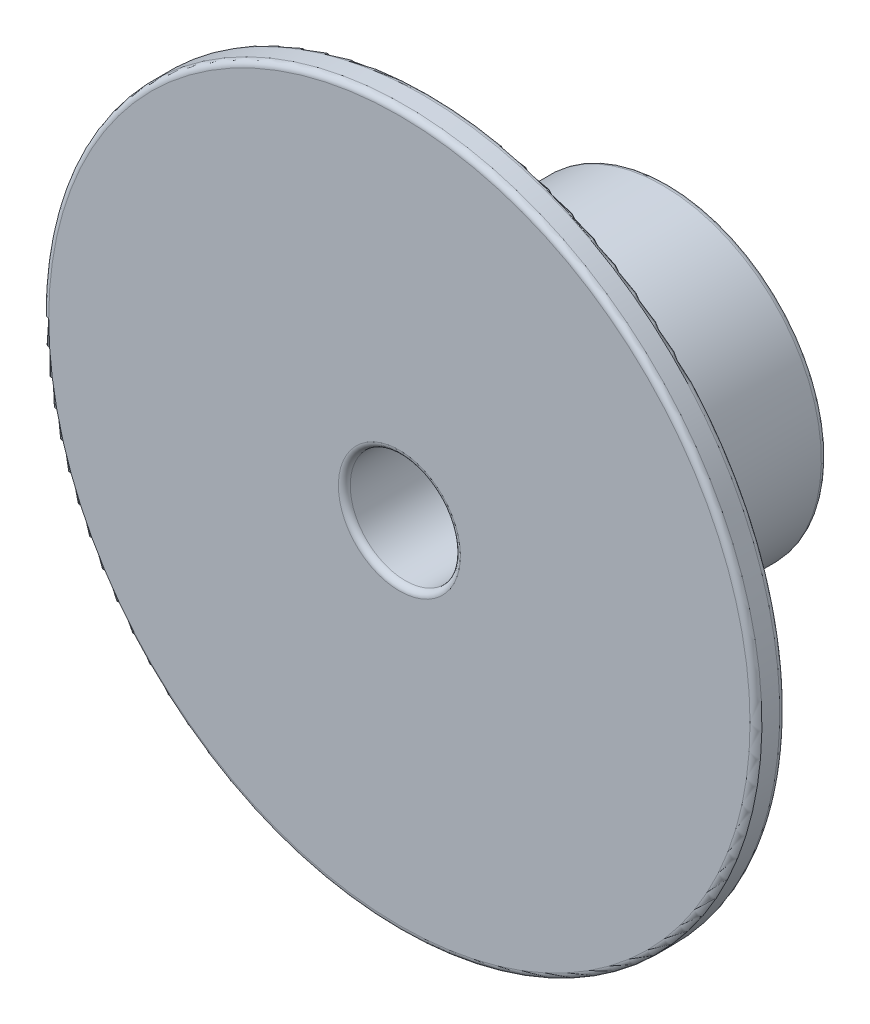
ISO-10303-21;
HEADER;
FILE_DESCRIPTION(('STEP AP214'),'2;1');
FILE_NAME('part.step','',(''),(''),'','','');
FILE_SCHEMA(('AUTOMOTIVE_DESIGN { 1 0 10303 214 1 1 1 1 }'));
ENDSEC;
DATA;
#1=APPLICATION_CONTEXT('core data for automotive mechanical design processes');
#2=APPLICATION_PROTOCOL_DEFINITION('international standard','automotive_design',2000,#1);
#3=PRODUCT_CONTEXT('',#1,'mechanical');
#4=PRODUCT('Part','Part','',(#3));
#5=PRODUCT_RELATED_PRODUCT_CATEGORY('part','',(#4));
#6=PRODUCT_DEFINITION_FORMATION('','',#4);
#7=PRODUCT_DEFINITION_CONTEXT('part definition',#1,'design');
#8=PRODUCT_DEFINITION('design','',#6,#7);
#9=PRODUCT_DEFINITION_SHAPE('','',#8);
#10=(LENGTH_UNIT() NAMED_UNIT(*) SI_UNIT(.MILLI.,.METRE.));
#11=(NAMED_UNIT(*) PLANE_ANGLE_UNIT() SI_UNIT($,.RADIAN.));
#12=(NAMED_UNIT(*) SI_UNIT($,.STERADIAN.) SOLID_ANGLE_UNIT());
#13=UNCERTAINTY_MEASURE_WITH_UNIT(LENGTH_MEASURE(1.E-05),#10,'distance_accuracy_value','');
#14=(GEOMETRIC_REPRESENTATION_CONTEXT(3) GLOBAL_UNCERTAINTY_ASSIGNED_CONTEXT((#13)) GLOBAL_UNIT_ASSIGNED_CONTEXT((#10,
#11,#12)) REPRESENTATION_CONTEXT('',''));
#15=CARTESIAN_POINT('',(0.,0.,0.));
#16=DIRECTION('',(0.,0.,1.));
#17=DIRECTION('',(1.,0.,0.));
#18=AXIS2_PLACEMENT_3D('',#15,#16,#17);
#19=CARTESIAN_POINT('',(0.,0.,12.21));
#20=DIRECTION('',(0.,0.,1.));
#21=DIRECTION('',(0.,-1.,0.));
#22=AXIS2_PLACEMENT_3D('',#19,#20,#21);
#23=CYLINDRICAL_SURFACE('',#22,18.);
#24=CARTESIAN_POINT('',(0.,0.,12.2999999999999));
#25=DIRECTION('',(0.,0.,-1.));
#26=DIRECTION('',(0.,1.,0.));
#27=AXIS2_PLACEMENT_3D('',#24,#25,#26);
#28=CIRCLE('',#27,18.);
#29=CARTESIAN_POINT('',(0.,18.,12.2999999999999));
#30=VERTEX_POINT('',#29);
#31=EDGE_CURVE('E116',#30,#30,#28,.T.);
#32=ORIENTED_EDGE('',*,*,#31,.F.);
#33=EDGE_LOOP('',(#32));
#34=FACE_BOUND('',#33,.T.);
#35=CARTESIAN_POINT('',(0.,0.,13.2000000000001));
#36=DIRECTION('',(0.,0.,1.));
#37=DIRECTION('',(0.,-1.,0.));
#38=AXIS2_PLACEMENT_3D('',#35,#36,#37);
#39=CIRCLE('',#38,18.);
#40=CARTESIAN_POINT('',(0.,-18.,13.2000000000001));
#41=VERTEX_POINT('',#40);
#42=EDGE_CURVE('E114',#41,#41,#39,.T.);
#43=ORIENTED_EDGE('',*,*,#42,.F.);
#44=EDGE_LOOP('',(#43));
#45=FACE_BOUND('',#44,.T.);
#46=ADVANCED_FACE('F17',(#34,#45),#23,.T.);
#47=CARTESIAN_POINT('',(0.,0.,12.3));
#48=DIRECTION('',(0.,0.,-1.));
#49=DIRECTION('',(0.,1.,0.));
#50=AXIS2_PLACEMENT_3D('',#47,#48,#49);
#51=TOROIDAL_SURFACE('',#50,17.7,0.300000000000005);
#52=ORIENTED_EDGE('',*,*,#31,.T.);
#53=EDGE_LOOP('',(#52));
#54=FACE_BOUND('',#53,.T.);
#55=CARTESIAN_POINT('',(0.,0.,12.));
#56=DIRECTION('',(0.,0.,-1.));
#57=DIRECTION('',(0.,1.,0.));
#58=AXIS2_PLACEMENT_3D('',#55,#56,#57);
#59=CIRCLE('',#58,17.7);
#60=CARTESIAN_POINT('',(0.,17.7,12.));
#61=VERTEX_POINT('',#60);
#62=EDGE_CURVE('E21',#61,#61,#59,.T.);
#63=ORIENTED_EDGE('',*,*,#62,.F.);
#64=EDGE_LOOP('',(#63));
#65=FACE_BOUND('',#64,.T.);
#66=ADVANCED_FACE('F120',(#54,#65),#51,.T.);
#67=CARTESIAN_POINT('',(0.,0.,13.2));
#68=DIRECTION('',(0.,0.,1.));
#69=DIRECTION('',(0.,-1.,0.));
#70=AXIS2_PLACEMENT_3D('',#67,#68,#69);
#71=TOROIDAL_SURFACE('',#70,17.7,0.299999999999994);
#72=ORIENTED_EDGE('',*,*,#42,.T.);
#73=EDGE_LOOP('',(#72));
#74=FACE_BOUND('',#73,.T.);
#75=CARTESIAN_POINT('',(0.,0.,13.5));
#76=DIRECTION('',(0.,0.,1.));
#77=DIRECTION('',(0.,-1.,0.));
#78=AXIS2_PLACEMENT_3D('',#75,#76,#77);
#79=CIRCLE('',#78,17.7);
#80=CARTESIAN_POINT('',(0.,-17.7,13.5));
#81=VERTEX_POINT('',#80);
#82=EDGE_CURVE('E135',#81,#81,#79,.T.);
#83=ORIENTED_EDGE('',*,*,#82,.F.);
#84=EDGE_LOOP('',(#83));
#85=FACE_BOUND('',#84,.T.);
#86=ADVANCED_FACE('F128',(#74,#85),#71,.T.);
#87=CARTESIAN_POINT('',(17.9124,-17.9124,12.));
#88=DIRECTION('',(0.,0.,-1.));
#89=DIRECTION('',(-1.,0.,0.));
#90=AXIS2_PLACEMENT_3D('',#87,#88,#89);
#91=PLANE('',#90);
#92=CARTESIAN_POINT('',(0.,0.,12.));
#93=DIRECTION('',(0.,0.,-1.));
#94=DIRECTION('',(-1.,0.,0.));
#95=AXIS2_PLACEMENT_3D('',#92,#93,#94);
#96=CIRCLE('',#95,8.49999999999987);
#97=CARTESIAN_POINT('',(-8.49999999999987,0.,12.));
#98=VERTEX_POINT('',#97);
#99=EDGE_CURVE('E137',#98,#98,#96,.T.);
#100=ORIENTED_EDGE('',*,*,#99,.F.);
#101=EDGE_LOOP('',(#100));
#102=FACE_BOUND('',#101,.T.);
#103=ORIENTED_EDGE('',*,*,#62,.T.);
#104=EDGE_LOOP('',(#103));
#105=FACE_BOUND('',#104,.T.);
#106=ADVANCED_FACE('F131',(#102,#105),#91,.T.);
#107=CARTESIAN_POINT('',(-17.9124,-17.9124,13.5));
#108=DIRECTION('',(0.,0.,1.));
#109=DIRECTION('',(1.,0.,0.));
#110=AXIS2_PLACEMENT_3D('',#107,#108,#109);
#111=PLANE('',#110);
#112=CARTESIAN_POINT('',(0.,0.,13.5));
#113=DIRECTION('',(0.,0.,1.));
#114=DIRECTION('',(0.,-1.,0.));
#115=AXIS2_PLACEMENT_3D('',#112,#113,#114);
#116=CIRCLE('',#115,3.07999999999992);
#117=CARTESIAN_POINT('',(0.,-3.07999999999992,13.5));
#118=VERTEX_POINT('',#117);
#119=EDGE_CURVE('E111',#118,#118,#116,.T.);
#120=ORIENTED_EDGE('',*,*,#119,.F.);
#121=EDGE_LOOP('',(#120));
#122=FACE_BOUND('',#121,.T.);
#123=ORIENTED_EDGE('',*,*,#82,.T.);
#124=EDGE_LOOP('',(#123));
#125=FACE_BOUND('',#124,.T.);
#126=ADVANCED_FACE('F147',(#122,#125),#111,.T.);
#127=CARTESIAN_POINT('',(0.,0.,11.5));
#128=DIRECTION('',(0.,0.,-1.));
#129=DIRECTION('',(-1.,0.,0.));
#130=AXIS2_PLACEMENT_3D('',#127,#128,#129);
#131=TOROIDAL_SURFACE('',#130,8.49999999999999,0.499999999999988);
#132=ORIENTED_EDGE('',*,*,#99,.T.);
#133=EDGE_LOOP('',(#132));
#134=FACE_BOUND('',#133,.T.);
#135=CARTESIAN_POINT('',(0.,0.,11.5));
#136=DIRECTION('',(0.,0.,-1.));
#137=DIRECTION('',(-1.,0.,0.));
#138=AXIS2_PLACEMENT_3D('',#135,#136,#137);
#139=CIRCLE('',#138,8.);
#140=CARTESIAN_POINT('',(-8.,0.,11.5));
#141=VERTEX_POINT('',#140);
#142=EDGE_CURVE('E108',#141,#141,#139,.T.);
#143=ORIENTED_EDGE('',*,*,#142,.F.);
#144=EDGE_LOOP('',(#143));
#145=FACE_BOUND('',#144,.T.);
#146=ADVANCED_FACE('F149',(#134,#145),#131,.F.);
#147=CARTESIAN_POINT('',(0.,0.,13.2));
#148=DIRECTION('',(0.,0.,1.));
#149=DIRECTION('',(0.,-1.,0.));
#150=AXIS2_PLACEMENT_3D('',#147,#148,#149);
#151=TOROIDAL_SURFACE('',#150,3.08,0.300000000000005);
#152=CARTESIAN_POINT('',(0.,0.,13.2));
#153=DIRECTION('',(0.,0.,1.));
#154=DIRECTION('',(0.,-1.,0.));
#155=AXIS2_PLACEMENT_3D('',#152,#153,#154);
#156=CIRCLE('',#155,2.78);
#157=CARTESIAN_POINT('',(0.,-2.78,13.2));
#158=VERTEX_POINT('',#157);
#159=EDGE_CURVE('E104',#158,#158,#156,.T.);
#160=ORIENTED_EDGE('',*,*,#159,.F.);
#161=EDGE_LOOP('',(#160));
#162=FACE_BOUND('',#161,.T.);
#163=ORIENTED_EDGE('',*,*,#119,.T.);
#164=EDGE_LOOP('',(#163));
#165=FACE_BOUND('',#164,.T.);
#166=ADVANCED_FACE('F145',(#162,#165),#151,.T.);
#167=CARTESIAN_POINT('',(0.,0.,0.20044822754096));
#168=DIRECTION('',(0.,0.,1.));
#169=DIRECTION('',(1.,0.,0.));
#170=AXIS2_PLACEMENT_3D('',#167,#168,#169);
#171=CYLINDRICAL_SURFACE('',#170,8.);
#172=CARTESIAN_POINT('',(0.,0.,0.20044822754096));
#173=DIRECTION('',(0.,0.,-1.));
#174=DIRECTION('',(0.,1.,0.));
#175=AXIS2_PLACEMENT_3D('',#172,#173,#174);
#176=CIRCLE('',#175,8.);
#177=CARTESIAN_POINT('',(0.,8.,0.20044822754096));
#178=VERTEX_POINT('',#177);
#179=EDGE_CURVE('E100',#178,#178,#176,.T.);
#180=ORIENTED_EDGE('',*,*,#179,.F.);
#181=EDGE_LOOP('',(#180));
#182=FACE_BOUND('',#181,.T.);
#183=ORIENTED_EDGE('',*,*,#142,.T.);
#184=EDGE_LOOP('',(#183));
#185=FACE_BOUND('',#184,.T.);
#186=ADVANCED_FACE('F162',(#182,#185),#171,.T.);
#187=CARTESIAN_POINT('',(0.,0.,5.61));
#188=DIRECTION('',(0.,0.,1.));
#189=DIRECTION('',(1.,0.,0.));
#190=AXIS2_PLACEMENT_3D('',#187,#188,#189);
#191=CYLINDRICAL_SURFACE('',#190,2.78);
#192=CARTESIAN_POINT('',(0.,0.,6.29999999999995));
#193=DIRECTION('',(0.,0.,1.));
#194=DIRECTION('',(1.,0.,0.));
#195=AXIS2_PLACEMENT_3D('',#192,#193,#194);
#196=CIRCLE('',#195,2.78);
#197=CARTESIAN_POINT('',(2.78,0.,6.29999999999995));
#198=VERTEX_POINT('',#197);
#199=EDGE_CURVE('E97',#198,#198,#196,.T.);
#200=ORIENTED_EDGE('',*,*,#199,.F.);
#201=EDGE_LOOP('',(#200));
#202=FACE_BOUND('',#201,.T.);
#203=ORIENTED_EDGE('',*,*,#159,.T.);
#204=EDGE_LOOP('',(#203));
#205=FACE_BOUND('',#204,.T.);
#206=ADVANCED_FACE('F166',(#202,#205),#191,.F.);
#207=CARTESIAN_POINT('',(0.,0.,0.200448227540976));
#208=DIRECTION('',(0.,0.,-1.));
#209=DIRECTION('',(-1.,0.,0.));
#210=AXIS2_PLACEMENT_3D('',#207,#208,#209);
#211=TOROIDAL_SURFACE('',#210,7.69999999999999,0.300000000000012);
#212=ORIENTED_EDGE('',*,*,#179,.T.);
#213=EDGE_LOOP('',(#212));
#214=FACE_BOUND('',#213,.T.);
#215=CARTESIAN_POINT('',(0.,0.,0.));
#216=DIRECTION('',(0.,0.,-1.));
#217=DIRECTION('',(0.,1.,0.));
#218=AXIS2_PLACEMENT_3D('',#215,#216,#217);
#219=CIRCLE('',#218,7.92320508075689);
#220=CARTESIAN_POINT('',(0.,7.92320508075689,0.));
#221=VERTEX_POINT('',#220);
#222=EDGE_CURVE('E95',#221,#221,#219,.T.);
#223=ORIENTED_EDGE('',*,*,#222,.F.);
#224=EDGE_LOOP('',(#223));
#225=FACE_BOUND('',#224,.T.);
#226=ADVANCED_FACE('F91',(#214,#225),#211,.T.);
#227=CARTESIAN_POINT('',(0.,0.,6.30000000000001));
#228=DIRECTION('',(0.,0.,-1.));
#229=DIRECTION('',(-1.,0.,0.));
#230=AXIS2_PLACEMENT_3D('',#227,#228,#229);
#231=TOROIDAL_SURFACE('',#230,3.08000000000001,0.300000000000012);
#232=ORIENTED_EDGE('',*,*,#199,.T.);
#233=EDGE_LOOP('',(#232));
#234=FACE_BOUND('',#233,.T.);
#235=CARTESIAN_POINT('',(3.08000000000001,0.,6.));
#236=CARTESIAN_POINT('',(3.08116361519987,0.606781346199183,6.));
#237=CARTESIAN_POINT('',(2.84554896013476,1.17866497168449,6.));
#238=CARTESIAN_POINT('',(2.61439116870311,1.73973090277684,6.));
#239=CARTESIAN_POINT('',(2.1778888860546,2.17788888605459,6.));
#240=CARTESIAN_POINT('',(1.74961629746775,2.60778595914609,6.));
#241=CARTESIAN_POINT('',(1.1786649716845,2.84554896013475,6.));
#242=CARTESIAN_POINT('',(0.618478205257921,3.07882924285762,6.));
#243=CARTESIAN_POINT('',(0.,3.08,6.));
#244=CARTESIAN_POINT('',(-0.606817587139169,3.08114868400895,6.));
#245=CARTESIAN_POINT('',(-1.1786649716845,2.84554896013475,6.));
#246=CARTESIAN_POINT('',(-1.73973090270367,2.61439116874529,6.));
#247=CARTESIAN_POINT('',(-2.1778888860546,2.17788888605459,6.));
#248=CARTESIAN_POINT('',(-2.60617681897323,1.75121935709127,6.));
#249=CARTESIAN_POINT('',(-2.84554896013476,1.17866497168449,6.));
#250=CARTESIAN_POINT('',(-2.96280367667811,0.898203336338133,6.));
#251=CARTESIAN_POINT('',(-3.02138723897213,0.600991288474661,6.));
#252=CARTESIAN_POINT('',(-3.08000000000001,0.303631106644211,6.));
#253=CARTESIAN_POINT('',(-3.08000000000001,0.,6.));
#254=B_SPLINE_CURVE_WITH_KNOTS('',2,(#235,#236,#237,#238,#239,#240,#241,#242,#243,#244,#245,
#246,#247,#248,#249,#250,#251,#252,#253),.UNSPECIFIED.,.F.,.F.,(3,2,2,2,2,2,2,2,2,3),(0.,0.125,
0.25,0.375,0.5,0.625,0.75,0.875,0.9375,1.),.UNSPECIFIED.);
#255=CARTESIAN_POINT('',(3.08000000000001,0.,6.));
#256=VERTEX_POINT('',#255);
#257=CARTESIAN_POINT('',(-3.08000000000001,0.,6.));
#258=VERTEX_POINT('',#257);
#259=EDGE_CURVE('E47',#256,#258,#254,.T.);
#260=ORIENTED_EDGE('',*,*,#259,.F.);
#261=CARTESIAN_POINT('',(-3.08000000000001,0.,6.));
#262=CARTESIAN_POINT('',(-3.0811636152052,-0.606781346193596,6.));
#263=CARTESIAN_POINT('',(-2.84554896013476,-1.1786649716845,6.));
#264=CARTESIAN_POINT('',(-2.61439116870774,-1.73973090275841,6.));
#265=CARTESIAN_POINT('',(-2.1778888860546,-2.1778888860546,6.));
#266=CARTESIAN_POINT('',(-1.74961629749977,-2.6077859591275,6.));
#267=CARTESIAN_POINT('',(-1.1786649716845,-2.84554896013476,6.));
#268=CARTESIAN_POINT('',(-0.618478205271911,-3.07882924285697,6.));
#269=CARTESIAN_POINT('',(0.,-3.08000000000001,6.));
#270=CARTESIAN_POINT('',(0.606817587166378,-3.08114868400963,6.));
#271=CARTESIAN_POINT('',(1.1786649716845,-2.84554896013476,6.));
#272=CARTESIAN_POINT('',(1.73973090276281,-2.61439116870928,6.));
#273=CARTESIAN_POINT('',(2.1778888860546,-2.1778888860546,6.));
#274=CARTESIAN_POINT('',(2.60617681896852,-1.75121935707358,6.));
#275=CARTESIAN_POINT('',(2.84554896013476,-1.1786649716845,6.));
#276=CARTESIAN_POINT('',(2.9628036766728,-0.898203336365008,6.));
#277=CARTESIAN_POINT('',(3.02138723897214,-0.600991288474617,6.));
#278=CARTESIAN_POINT('',(3.08000000000001,-0.303631106644184,6.));
#279=CARTESIAN_POINT('',(3.08000000000001,0.,6.));
#280=B_SPLINE_CURVE_WITH_KNOTS('',2,(#261,#262,#263,#264,#265,#266,#267,#268,#269,#270,#271,
#272,#273,#274,#275,#276,#277,#278,#279),.UNSPECIFIED.,.F.,.F.,(3,2,2,2,2,2,2,2,2,3),(0.,0.125,
0.25,0.375,0.5,0.625,0.75,0.875,0.9375,1.),.UNSPECIFIED.);
#281=EDGE_CURVE('E44',#258,#256,#280,.T.);
#282=ORIENTED_EDGE('',*,*,#281,.F.);
#283=EDGE_LOOP('',(#260,#282));
#284=FACE_BOUND('',#283,.T.);
#285=ADVANCED_FACE('F46',(#234,#284),#231,.T.);
#286=CARTESIAN_POINT('',(0.,0.,0.299999999999989));
#287=DIRECTION('',(0.,0.,-1.));
#288=DIRECTION('',(-1.,0.,0.));
#289=AXIS2_PLACEMENT_3D('',#286,#287,#288);
#290=TOROIDAL_SURFACE('',#289,7.92320508075689,0.299999999999985);
#291=ORIENTED_EDGE('',*,*,#222,.T.);
#292=EDGE_LOOP('',(#291));
#293=FACE_BOUND('',#292,.T.);
#294=CARTESIAN_POINT('',(0.,0.,0.149999999999995));
#295=DIRECTION('',(0.,0.,-1.));
#296=DIRECTION('',(0.,1.,0.));
#297=AXIS2_PLACEMENT_3D('',#294,#295,#296);
#298=CIRCLE('',#297,7.66339745962156);
#299=CARTESIAN_POINT('',(0.,7.66339745962156,0.149999999999995));
#300=VERTEX_POINT('',#299);
#301=EDGE_CURVE('E51',#300,#300,#298,.T.);
#302=ORIENTED_EDGE('',*,*,#301,.F.);
#303=EDGE_LOOP('',(#302));
#304=FACE_BOUND('',#303,.T.);
#305=ADVANCED_FACE('F71',(#293,#304),#290,.T.);
#306=CARTESIAN_POINT('',(4.04518992927065,-4.04518992927065,6.));
#307=DIRECTION('',(0.,0.,-1.));
#308=DIRECTION('',(-1.,0.,0.));
#309=AXIS2_PLACEMENT_3D('',#306,#307,#308);
#310=PLANE('',#309);
#311=ORIENTED_EDGE('',*,*,#281,.T.);
#312=ORIENTED_EDGE('',*,*,#259,.T.);
#313=EDGE_LOOP('',(#311,#312));
#314=FACE_BOUND('',#313,.T.);
#315=CARTESIAN_POINT('',(-3.99722325026744,0.,6.));
#316=CARTESIAN_POINT('',(-3.99873327143629,0.787478307971239,6.));
#317=CARTESIAN_POINT('',(-3.69295274780032,1.52967111334185,6.));
#318=CARTESIAN_POINT('',(-3.39295906722217,2.25781804936717,6.));
#319=CARTESIAN_POINT('',(-2.82646366618063,2.82646366618062,6.));
#320=CARTESIAN_POINT('',(-2.27065587609634,3.38438110565338,6.));
#321=CARTESIAN_POINT('',(-1.52967111334186,3.69295274780031,6.));
#322=CARTESIAN_POINT('',(-0.802665911319301,3.99570281813042,6.));
#323=CARTESIAN_POINT('',(0.,3.99722325026743,6.));
#324=CARTESIAN_POINT('',(0.78752266229418,3.99871499764015,6.));
#325=CARTESIAN_POINT('',(1.52967111334186,3.69295274780031,6.));
#326=CARTESIAN_POINT('',(2.25781804942689,3.39295906718688,6.));
#327=CARTESIAN_POINT('',(2.82646366618062,2.82646366618062,6.));
#328=CARTESIAN_POINT('',(3.04919359380279,2.60457594569713,6.));
#329=CARTESIAN_POINT('',(3.2344015480182,2.34993939704879,6.));
#330=CARTESIAN_POINT('',(3.5061841649616,1.9762740874013,6.));
#331=CARTESIAN_POINT('',(3.69295274780032,1.52967111334185,6.));
#332=CARTESIAN_POINT('',(3.84511851335003,1.16581075518293,6.));
#333=CARTESIAN_POINT('',(3.92115562381531,0.779966347997176,6.));
#334=CARTESIAN_POINT('',(3.99722325026744,0.393967089807948,6.));
#335=CARTESIAN_POINT('',(3.99722325026744,0.,6.));
#336=B_SPLINE_CURVE_WITH_KNOTS('',2,(#315,#316,#317,#318,#319,#320,#321,#322,#323,#324,#325,
#326,#327,#328,#329,#330,#331,#332,#333,#334,#335),.UNSPECIFIED.,.F.,.F.,(3,2,2,2,2,2,2,2,2,2,
3),(0.,0.125,0.25,0.375,0.5,0.625,0.75,0.8,0.875,0.9375,1.),.UNSPECIFIED.);
#337=CARTESIAN_POINT('',(-3.99722325026744,0.,6.));
#338=VERTEX_POINT('',#337);
#339=CARTESIAN_POINT('',(3.99722325026744,0.,6.));
#340=VERTEX_POINT('',#339);
#341=EDGE_CURVE('E33',#338,#340,#336,.T.);
#342=ORIENTED_EDGE('',*,*,#341,.T.);
#343=CARTESIAN_POINT('',(0.,0.,6.));
#344=DIRECTION('',(0.,0.,-1.));
#345=DIRECTION('',(0.,1.,0.));
#346=AXIS2_PLACEMENT_3D('',#343,#344,#345);
#347=CIRCLE('',#346,3.99722325026745);
#348=EDGE_CURVE('E26',#338,#340,#347,.F.);
#349=ORIENTED_EDGE('',*,*,#348,.F.);
#350=EDGE_LOOP('',(#342,#349));
#351=FACE_BOUND('',#350,.T.);
#352=ADVANCED_FACE('F50',(#314,#351),#310,.T.);
#353=CARTESIAN_POINT('',(0.,0.,5.75));
#354=DIRECTION('',(0.,0.,-1.));
#355=DIRECTION('',(-1.,0.,0.));
#356=AXIS2_PLACEMENT_3D('',#353,#354,#355);
#357=CONICAL_SURFACE('',#356,4.43023595215965,0.523598775598299);
#358=ORIENTED_EDGE('',*,*,#301,.T.);
#359=EDGE_LOOP('',(#358));
#360=FACE_BOUND('',#359,.T.);
#361=CARTESIAN_POINT('',(0.,0.,5.75));
#362=DIRECTION('',(0.,0.,-1.));
#363=DIRECTION('',(0.,1.,0.));
#364=AXIS2_PLACEMENT_3D('',#361,#362,#363);
#365=CIRCLE('',#364,4.43023595215965);
#366=CARTESIAN_POINT('',(0.,4.43023595215965,5.75));
#367=VERTEX_POINT('',#366);
#368=EDGE_CURVE('E11',#367,#367,#365,.T.);
#369=ORIENTED_EDGE('',*,*,#368,.F.);
#370=EDGE_LOOP('',(#369));
#371=FACE_BOUND('',#370,.T.);
#372=ADVANCED_FACE('F70',(#360,#371),#357,.F.);
#373=CARTESIAN_POINT('',(0.,0.,5.50000000000001));
#374=DIRECTION('',(0.,0.,-1.));
#375=DIRECTION('',(0.,1.,0.));
#376=AXIS2_PLACEMENT_3D('',#373,#374,#375);
#377=TOROIDAL_SURFACE('',#376,3.99722325026744,0.499999999999992);
#378=ORIENTED_EDGE('',*,*,#348,.T.);
#379=ORIENTED_EDGE('',*,*,#341,.F.);
#380=EDGE_LOOP('',(#378,#379));
#381=FACE_BOUND('',#380,.T.);
#382=ORIENTED_EDGE('',*,*,#368,.T.);
#383=EDGE_LOOP('',(#382));
#384=FACE_BOUND('',#383,.T.);
#385=ADVANCED_FACE('F19',(#381,#384),#377,.F.);
#386=CLOSED_SHELL('',(#46,#66,#86,#106,#126,#146,#166,#186,#206,#226,#285,#305,#352,#372,#385));
#387=MANIFOLD_SOLID_BREP('B1',#386);
#388=ADVANCED_BREP_SHAPE_REPRESENTATION('',(#18,#387),#14);
#389=SHAPE_DEFINITION_REPRESENTATION(#9,#388);
ENDSEC;
END-ISO-10303-21;
